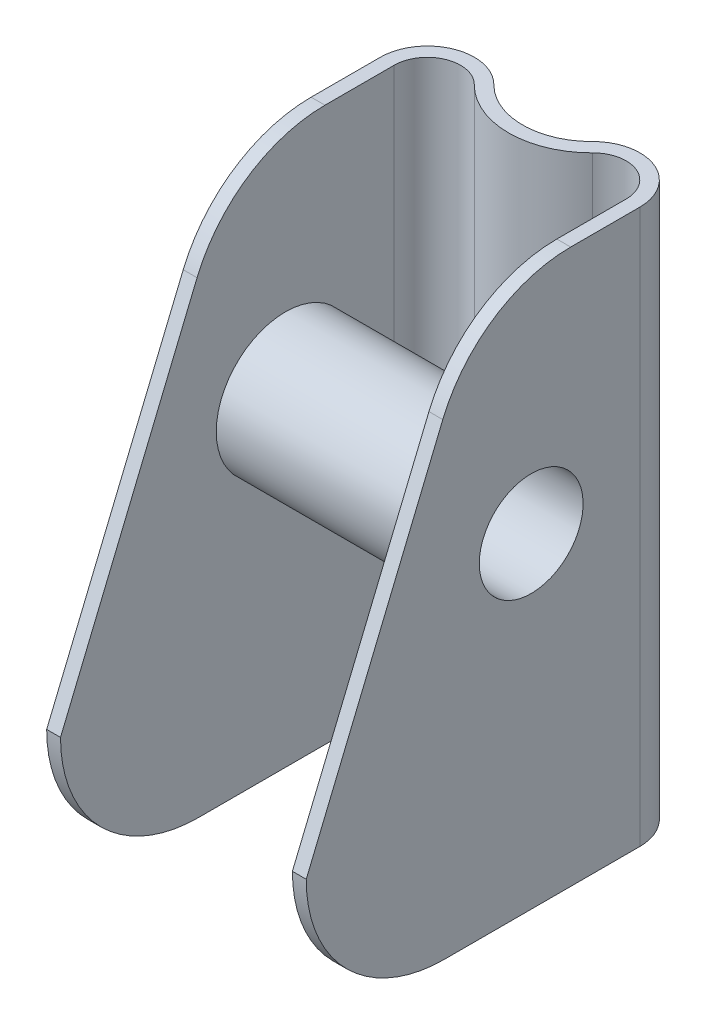
ISO-10303-21;
HEADER;
FILE_DESCRIPTION(('STEP AP214'),'2;1');
FILE_NAME('part.step','',(''),(''),'','','');
FILE_SCHEMA(('AUTOMOTIVE_DESIGN { 1 0 10303 214 1 1 1 1 }'));
ENDSEC;
DATA;
#1=APPLICATION_CONTEXT('core data for automotive mechanical design processes');
#2=APPLICATION_PROTOCOL_DEFINITION('international standard','automotive_design',2000,#1);
#3=PRODUCT_CONTEXT('',#1,'mechanical');
#4=PRODUCT('Part','Part','',(#3));
#5=PRODUCT_RELATED_PRODUCT_CATEGORY('part','',(#4));
#6=PRODUCT_DEFINITION_FORMATION('','',#4);
#7=PRODUCT_DEFINITION_CONTEXT('part definition',#1,'design');
#8=PRODUCT_DEFINITION('design','',#6,#7);
#9=PRODUCT_DEFINITION_SHAPE('','',#8);
#10=(LENGTH_UNIT() NAMED_UNIT(*) SI_UNIT(.MILLI.,.METRE.));
#11=(NAMED_UNIT(*) PLANE_ANGLE_UNIT() SI_UNIT($,.RADIAN.));
#12=(NAMED_UNIT(*) SI_UNIT($,.STERADIAN.) SOLID_ANGLE_UNIT());
#13=UNCERTAINTY_MEASURE_WITH_UNIT(LENGTH_MEASURE(1.E-05),#10,'distance_accuracy_value','');
#14=(GEOMETRIC_REPRESENTATION_CONTEXT(3) GLOBAL_UNCERTAINTY_ASSIGNED_CONTEXT((#13)) GLOBAL_UNIT_ASSIGNED_CONTEXT((#10,
#11,#12)) REPRESENTATION_CONTEXT('',''));
#15=CARTESIAN_POINT('',(0.,0.,0.));
#16=DIRECTION('',(0.,0.,1.));
#17=DIRECTION('',(1.,0.,0.));
#18=AXIS2_PLACEMENT_3D('',#15,#16,#17);
#19=CARTESIAN_POINT('',(45.085,-101.6,-61.2213976964227));
#20=DIRECTION('',(-1.,0.,0.));
#21=DIRECTION('',(0.,0.,1.));
#22=AXIS2_PLACEMENT_3D('',#19,#20,#21);
#23=PLANE('',#22);
#24=CARTESIAN_POINT('',(45.085,-41.91,-41.275));
#25=DIRECTION('',(-1.,0.,0.));
#26=DIRECTION('',(0.,0.,1.));
#27=AXIS2_PLACEMENT_3D('',#24,#25,#26);
#28=CIRCLE('',#27,12.7);
#29=CARTESIAN_POINT('',(45.085,-41.91,-28.575));
#30=VERTEX_POINT('',#29);
#31=EDGE_CURVE('E224',#30,#30,#28,.T.);
#32=ORIENTED_EDGE('',*,*,#31,.F.);
#33=EDGE_LOOP('',(#32));
#34=FACE_BOUND('',#33,.T.);
#35=DIRECTION('',(0.,0.923951918105183,-0.382508631314058));
#36=VECTOR('',#35,1.);
#37=CARTESIAN_POINT('',(45.085,-76.2468126521066,0.0193800598652372));
#38=LINE('',#37,#36);
#39=CARTESIAN_POINT('',(45.085,-76.2000000000001,0.));
#40=VERTEX_POINT('',#39);
#41=CARTESIAN_POINT('',(45.085,-15.6842807646229,-25.0530189765511));
#42=VERTEX_POINT('',#41);
#43=EDGE_CURVE('E199',#40,#42,#38,.T.);
#44=ORIENTED_EDGE('',*,*,#43,.T.);
#45=CARTESIAN_POINT('',(45.085,-25.4,-48.5213976964227));
#46=DIRECTION('',(-1.,0.,0.));
#47=DIRECTION('',(0.,0.,1.));
#48=AXIS2_PLACEMENT_3D('',#45,#46,#47);
#49=CIRCLE('',#48,25.4);
#50=CARTESIAN_POINT('',(45.085,0.,-48.5213976964227));
#51=VERTEX_POINT('',#50);
#52=EDGE_CURVE('E206',#42,#51,#49,.T.);
#53=ORIENTED_EDGE('',*,*,#52,.T.);
#54=DIRECTION('',(0.,0.,1.));
#55=VECTOR('',#54,1.);
#56=CARTESIAN_POINT('',(45.085,0.,-61.2213976964227));
#57=LINE('',#56,#55);
#58=CARTESIAN_POINT('',(45.085,0.,-61.2213976964227));
#59=VERTEX_POINT('',#58);
#60=EDGE_CURVE('E256',#59,#51,#57,.T.);
#61=ORIENTED_EDGE('',*,*,#60,.F.);
#62=DIRECTION('',(0.,1.,0.));
#63=VECTOR('',#62,1.);
#64=CARTESIAN_POINT('',(45.085,-101.6,-61.2213976964227));
#65=LINE('',#64,#63);
#66=CARTESIAN_POINT('',(45.085,-101.6,-61.2213976964227));
#67=VERTEX_POINT('',#66);
#68=EDGE_CURVE('E225',#67,#59,#65,.T.);
#69=ORIENTED_EDGE('',*,*,#68,.F.);
#70=DIRECTION('',(0.,0.,1.));
#71=VECTOR('',#70,1.);
#72=CARTESIAN_POINT('',(45.085,-101.6,-61.2213976964227));
#73=LINE('',#72,#71);
#74=CARTESIAN_POINT('',(45.085,-101.6,-25.4));
#75=VERTEX_POINT('',#74);
#76=EDGE_CURVE('E229',#67,#75,#73,.T.);
#77=ORIENTED_EDGE('',*,*,#76,.T.);
#78=CARTESIAN_POINT('',(45.085,-76.2,-25.4));
#79=DIRECTION('',(-1.,0.,0.));
#80=DIRECTION('',(0.,0.,1.));
#81=AXIS2_PLACEMENT_3D('',#78,#79,#80);
#82=CIRCLE('',#81,25.4);
#83=EDGE_CURVE('E83',#40,#75,#82,.F.);
#84=ORIENTED_EDGE('',*,*,#83,.F.);
#85=EDGE_LOOP('',(#44,#53,#61,#69,#77,#84));
#86=FACE_BOUND('',#85,.T.);
#87=ADVANCED_FACE('F61',(#34,#86),#23,.T.);
#88=CARTESIAN_POINT('',(2.54,-101.6,0.));
#89=DIRECTION('',(1.,0.,0.));
#90=DIRECTION('',(0.,0.,-1.));
#91=AXIS2_PLACEMENT_3D('',#88,#89,#90);
#92=PLANE('',#91);
#93=CARTESIAN_POINT('',(2.54,-41.91,-41.275));
#94=DIRECTION('',(1.,0.,0.));
#95=DIRECTION('',(0.,0.,-1.));
#96=AXIS2_PLACEMENT_3D('',#93,#94,#95);
#97=CIRCLE('',#96,12.7);
#98=CARTESIAN_POINT('',(2.54,-41.91,-53.975));
#99=VERTEX_POINT('',#98);
#100=EDGE_CURVE('E221',#99,#99,#97,.T.);
#101=ORIENTED_EDGE('',*,*,#100,.F.);
#102=EDGE_LOOP('',(#101));
#103=FACE_BOUND('',#102,.T.);
#104=DIRECTION('',(0.,0.,-1.));
#105=VECTOR('',#104,1.);
#106=CARTESIAN_POINT('',(2.54,0.,0.));
#107=LINE('',#106,#105);
#108=CARTESIAN_POINT('',(2.54,0.,-48.5213976964227));
#109=VERTEX_POINT('',#108);
#110=CARTESIAN_POINT('',(2.54,0.,-61.2213976964227));
#111=VERTEX_POINT('',#110);
#112=EDGE_CURVE('E270',#109,#111,#107,.T.);
#113=ORIENTED_EDGE('',*,*,#112,.F.);
#114=CARTESIAN_POINT('',(2.54,-25.4,-48.5213976964227));
#115=DIRECTION('',(1.,0.,0.));
#116=DIRECTION('',(0.,0.,-1.));
#117=AXIS2_PLACEMENT_3D('',#114,#115,#116);
#118=CIRCLE('',#117,25.4);
#119=CARTESIAN_POINT('',(2.54,-15.6842807646229,-25.0530189765511));
#120=VERTEX_POINT('',#119);
#121=EDGE_CURVE('E204',#109,#120,#118,.T.);
#122=ORIENTED_EDGE('',*,*,#121,.T.);
#123=DIRECTION('',(0.,-0.923951918105183,0.382508631314058));
#124=VECTOR('',#123,1.);
#125=CARTESIAN_POINT('',(2.54,-97.8836535330442,8.97685742329807));
#126=LINE('',#125,#124);
#127=CARTESIAN_POINT('',(2.54,-76.2000000000001,0.));
#128=VERTEX_POINT('',#127);
#129=EDGE_CURVE('E179',#120,#128,#126,.T.);
#130=ORIENTED_EDGE('',*,*,#129,.T.);
#131=CARTESIAN_POINT('',(2.54,-76.2,-25.4));
#132=DIRECTION('',(1.,0.,0.));
#133=DIRECTION('',(0.,0.,-1.));
#134=AXIS2_PLACEMENT_3D('',#131,#132,#133);
#135=CIRCLE('',#134,25.4);
#136=CARTESIAN_POINT('',(2.54,-101.6,-25.4));
#137=VERTEX_POINT('',#136);
#138=EDGE_CURVE('E216',#137,#128,#135,.F.);
#139=ORIENTED_EDGE('',*,*,#138,.F.);
#140=DIRECTION('',(0.,0.,-1.));
#141=VECTOR('',#140,1.);
#142=CARTESIAN_POINT('',(2.54,-101.6,0.));
#143=LINE('',#142,#141);
#144=CARTESIAN_POINT('',(2.54,-101.6,-61.2213976964227));
#145=VERTEX_POINT('',#144);
#146=EDGE_CURVE('E244',#137,#145,#143,.T.);
#147=ORIENTED_EDGE('',*,*,#146,.T.);
#148=DIRECTION('',(0.,1.,0.));
#149=VECTOR('',#148,1.);
#150=CARTESIAN_POINT('',(2.54,-101.6,-61.2213976964227));
#151=LINE('',#150,#149);
#152=EDGE_CURVE('E285',#145,#111,#151,.T.);
#153=ORIENTED_EDGE('',*,*,#152,.T.);
#154=EDGE_LOOP('',(#113,#122,#130,#139,#147,#153));
#155=FACE_BOUND('',#154,.T.);
#156=ADVANCED_FACE('F311',(#103,#155),#92,.T.);
#157=CARTESIAN_POINT('',(0.,-101.6,0.));
#158=DIRECTION('',(1.,0.,0.));
#159=DIRECTION('',(0.,0.,-1.));
#160=AXIS2_PLACEMENT_3D('',#157,#158,#159);
#161=PLANE('',#160);
#162=CARTESIAN_POINT('',(0.,-41.91,-41.275));
#163=DIRECTION('',(-1.,0.,0.));
#164=DIRECTION('',(0.,0.,1.));
#165=AXIS2_PLACEMENT_3D('',#162,#163,#164);
#166=CIRCLE('',#165,9.525);
#167=CARTESIAN_POINT('',(0.,-41.91,-31.75));
#168=VERTEX_POINT('',#167);
#169=EDGE_CURVE('E220',#168,#168,#166,.T.);
#170=ORIENTED_EDGE('',*,*,#169,.F.);
#171=EDGE_LOOP('',(#170));
#172=FACE_BOUND('',#171,.T.);
#173=CARTESIAN_POINT('',(0.,-25.4,-48.5213976964227));
#174=DIRECTION('',(-1.,0.,0.));
#175=DIRECTION('',(0.,0.,1.));
#176=AXIS2_PLACEMENT_3D('',#173,#174,#175);
#177=CIRCLE('',#176,25.4);
#178=CARTESIAN_POINT('',(0.,-15.6842807646229,-25.0530189765511));
#179=VERTEX_POINT('',#178);
#180=CARTESIAN_POINT('',(0.,0.,-48.5213976964227));
#181=VERTEX_POINT('',#180);
#182=EDGE_CURVE('E183',#179,#181,#177,.T.);
#183=ORIENTED_EDGE('',*,*,#182,.T.);
#184=DIRECTION('',(0.,0.,-1.));
#185=VECTOR('',#184,1.);
#186=CARTESIAN_POINT('',(0.,0.,0.));
#187=LINE('',#186,#185);
#188=CARTESIAN_POINT('',(0.,0.,-61.2213976964227));
#189=VERTEX_POINT('',#188);
#190=EDGE_CURVE('E268',#181,#189,#187,.T.);
#191=ORIENTED_EDGE('',*,*,#190,.T.);
#192=DIRECTION('',(0.,1.,0.));
#193=VECTOR('',#192,1.);
#194=CARTESIAN_POINT('',(0.,-101.6,-61.2213976964227));
#195=LINE('',#194,#193);
#196=CARTESIAN_POINT('',(0.,-101.6,-61.2213976964227));
#197=VERTEX_POINT('',#196);
#198=EDGE_CURVE('E288',#197,#189,#195,.T.);
#199=ORIENTED_EDGE('',*,*,#198,.F.);
#200=DIRECTION('',(0.,0.,-1.));
#201=VECTOR('',#200,1.);
#202=CARTESIAN_POINT('',(0.,-101.6,0.));
#203=LINE('',#202,#201);
#204=CARTESIAN_POINT('',(0.,-101.6,-25.4));
#205=VERTEX_POINT('',#204);
#206=EDGE_CURVE('E242',#205,#197,#203,.T.);
#207=ORIENTED_EDGE('',*,*,#206,.F.);
#208=CARTESIAN_POINT('',(0.,-76.2,-25.4));
#209=DIRECTION('',(1.,0.,0.));
#210=DIRECTION('',(0.,0.,-1.));
#211=AXIS2_PLACEMENT_3D('',#208,#209,#210);
#212=CIRCLE('',#211,25.4);
#213=CARTESIAN_POINT('',(0.,-76.2000000000001,0.));
#214=VERTEX_POINT('',#213);
#215=EDGE_CURVE('E75',#214,#205,#212,.T.);
#216=ORIENTED_EDGE('',*,*,#215,.F.);
#217=DIRECTION('',(0.,0.923951918105183,-0.382508631314058));
#218=VECTOR('',#217,1.);
#219=CARTESIAN_POINT('',(0.,-122.583612597842,19.202440973971));
#220=LINE('',#219,#218);
#221=EDGE_CURVE('E177',#214,#179,#220,.T.);
#222=ORIENTED_EDGE('',*,*,#221,.T.);
#223=EDGE_LOOP('',(#183,#191,#199,#207,#216,#222));
#224=FACE_BOUND('',#223,.T.);
#225=ADVANCED_FACE('F191',(#172,#224),#161,.F.);
#226=CARTESIAN_POINT('',(47.625,-101.6,-61.2213976964227));
#227=DIRECTION('',(-1.,0.,0.));
#228=DIRECTION('',(0.,0.,1.));
#229=AXIS2_PLACEMENT_3D('',#226,#227,#228);
#230=PLANE('',#229);
#231=CARTESIAN_POINT('',(47.625,-41.91,-41.275));
#232=DIRECTION('',(-1.,0.,0.));
#233=DIRECTION('',(0.,0.,1.));
#234=AXIS2_PLACEMENT_3D('',#231,#232,#233);
#235=CIRCLE('',#234,9.525);
#236=CARTESIAN_POINT('',(47.625,-41.91,-31.75));
#237=VERTEX_POINT('',#236);
#238=EDGE_CURVE('E228',#237,#237,#235,.T.);
#239=ORIENTED_EDGE('',*,*,#238,.T.);
#240=EDGE_LOOP('',(#239));
#241=FACE_BOUND('',#240,.T.);
#242=CARTESIAN_POINT('',(47.625,-25.4,-48.5213976964227));
#243=DIRECTION('',(-1.,0.,0.));
#244=DIRECTION('',(0.,0.,1.));
#245=AXIS2_PLACEMENT_3D('',#242,#243,#244);
#246=CIRCLE('',#245,25.4);
#247=CARTESIAN_POINT('',(47.625,-15.6842807646229,-25.0530189765511));
#248=VERTEX_POINT('',#247);
#249=CARTESIAN_POINT('',(47.625,0.,-48.5213976964227));
#250=VERTEX_POINT('',#249);
#251=EDGE_CURVE('E202',#248,#250,#246,.T.);
#252=ORIENTED_EDGE('',*,*,#251,.F.);
#253=DIRECTION('',(0.,0.923951918105183,-0.382508631314058));
#254=VECTOR('',#253,1.);
#255=CARTESIAN_POINT('',(47.625,-76.2468126521066,0.0193800598652372));
#256=LINE('',#255,#254);
#257=CARTESIAN_POINT('',(47.625,-76.2000000000001,0.));
#258=VERTEX_POINT('',#257);
#259=EDGE_CURVE('E193',#258,#248,#256,.T.);
#260=ORIENTED_EDGE('',*,*,#259,.F.);
#261=CARTESIAN_POINT('',(47.625,-76.2,-25.4));
#262=DIRECTION('',(-1.,0.,0.));
#263=DIRECTION('',(0.,0.,1.));
#264=AXIS2_PLACEMENT_3D('',#261,#262,#263);
#265=CIRCLE('',#264,25.4);
#266=CARTESIAN_POINT('',(47.625,-101.6,-25.4));
#267=VERTEX_POINT('',#266);
#268=EDGE_CURVE('E213',#258,#267,#265,.F.);
#269=ORIENTED_EDGE('',*,*,#268,.T.);
#270=DIRECTION('',(0.,0.,1.));
#271=VECTOR('',#270,1.);
#272=CARTESIAN_POINT('',(47.625,-101.6,-61.2213976964227));
#273=LINE('',#272,#271);
#274=CARTESIAN_POINT('',(47.625,-101.6,-61.2213976964227));
#275=VERTEX_POINT('',#274);
#276=EDGE_CURVE('E232',#275,#267,#273,.T.);
#277=ORIENTED_EDGE('',*,*,#276,.F.);
#278=DIRECTION('',(0.,1.,0.));
#279=VECTOR('',#278,1.);
#280=CARTESIAN_POINT('',(47.625,-101.6,-61.2213976964227));
#281=LINE('',#280,#279);
#282=CARTESIAN_POINT('',(47.625,0.,-61.2213976964227));
#283=VERTEX_POINT('',#282);
#284=EDGE_CURVE('E255',#275,#283,#281,.T.);
#285=ORIENTED_EDGE('',*,*,#284,.T.);
#286=DIRECTION('',(0.,0.,1.));
#287=VECTOR('',#286,1.);
#288=CARTESIAN_POINT('',(47.625,0.,-61.2213976964227));
#289=LINE('',#288,#287);
#290=EDGE_CURVE('E259',#283,#250,#289,.T.);
#291=ORIENTED_EDGE('',*,*,#290,.T.);
#292=EDGE_LOOP('',(#252,#260,#269,#277,#285,#291));
#293=FACE_BOUND('',#292,.T.);
#294=ADVANCED_FACE('F344',(#241,#293),#230,.F.);
#295=CARTESIAN_POINT('',(38.9963976964227,0.,-61.2213976964227));
#296=DIRECTION('',(0.,-1.,0.));
#297=DIRECTION('',(0.,0.,-1.));
#298=AXIS2_PLACEMENT_3D('',#295,#296,#297);
#299=PLANE('',#298);
#300=DIRECTION('',(-1.,0.,0.));
#301=VECTOR('',#300,1.);
#302=CARTESIAN_POINT('',(101.6,0.,-48.5213976964227));
#303=LINE('',#302,#301);
#304=EDGE_CURVE('E12',#250,#51,#303,.T.);
#305=ORIENTED_EDGE('',*,*,#304,.F.);
#306=ORIENTED_EDGE('',*,*,#290,.F.);
#307=CARTESIAN_POINT('',(38.9963976964227,0.,-61.2213976964227));
#308=DIRECTION('',(0.,-1.,0.));
#309=DIRECTION('',(0.,0.,-1.));
#310=AXIS2_PLACEMENT_3D('',#307,#308,#309);
#311=CIRCLE('',#310,8.62860230357726);
#312=CARTESIAN_POINT('',(32.8536691305354,0.,-67.281072892267));
#313=VERTEX_POINT('',#312);
#314=EDGE_CURVE('E262',#313,#283,#311,.T.);
#315=ORIENTED_EDGE('',*,*,#314,.F.);
#316=CARTESIAN_POINT('',(23.8125,0.,-76.2));
#317=DIRECTION('',(0.,1.,0.));
#318=DIRECTION('',(0.,0.,1.));
#319=AXIS2_PLACEMENT_3D('',#316,#317,#318);
#320=CIRCLE('',#319,12.7);
#321=CARTESIAN_POINT('',(14.7713308694646,0.,-67.281072892267));
#322=VERTEX_POINT('',#321);
#323=EDGE_CURVE('E264',#322,#313,#320,.T.);
#324=ORIENTED_EDGE('',*,*,#323,.F.);
#325=CARTESIAN_POINT('',(8.62860230357726,0.,-61.2213976964227));
#326=DIRECTION('',(0.,-1.,0.));
#327=DIRECTION('',(0.,0.,-1.));
#328=AXIS2_PLACEMENT_3D('',#325,#326,#327);
#329=CIRCLE('',#328,8.62860230357727);
#330=EDGE_CURVE('E266',#189,#322,#329,.T.);
#331=ORIENTED_EDGE('',*,*,#330,.F.);
#332=ORIENTED_EDGE('',*,*,#190,.F.);
#333=EDGE_CURVE('E64',#109,#181,#303,.T.);
#334=ORIENTED_EDGE('',*,*,#333,.F.);
#335=ORIENTED_EDGE('',*,*,#112,.T.);
#336=CARTESIAN_POINT('',(8.62860230357726,0.,-61.2213976964227));
#337=DIRECTION('',(0.,1.,0.));
#338=DIRECTION('',(1.,0.,0.));
#339=AXIS2_PLACEMENT_3D('',#336,#337,#338);
#340=CIRCLE('',#339,6.08860230357727);
#341=CARTESIAN_POINT('',(12.9630970433575,0.,-65.4972874707204));
#342=VERTEX_POINT('',#341);
#343=EDGE_CURVE('E272',#111,#342,#340,.F.);
#344=ORIENTED_EDGE('',*,*,#343,.T.);
#345=CARTESIAN_POINT('',(23.8125,0.,-76.2));
#346=DIRECTION('',(0.,1.,0.));
#347=DIRECTION('',(1.,0.,0.));
#348=AXIS2_PLACEMENT_3D('',#345,#346,#347);
#349=CIRCLE('',#348,15.24);
#350=CARTESIAN_POINT('',(34.6619029566425,0.,-65.4972874707204));
#351=VERTEX_POINT('',#350);
#352=EDGE_CURVE('E275',#342,#351,#349,.T.);
#353=ORIENTED_EDGE('',*,*,#352,.T.);
#354=CARTESIAN_POINT('',(38.9963976964227,0.,-61.2213976964227));
#355=DIRECTION('',(0.,1.,0.));
#356=DIRECTION('',(1.,0.,0.));
#357=AXIS2_PLACEMENT_3D('',#354,#355,#356);
#358=CIRCLE('',#357,6.08860230357726);
#359=EDGE_CURVE('E233',#351,#59,#358,.F.);
#360=ORIENTED_EDGE('',*,*,#359,.T.);
#361=ORIENTED_EDGE('',*,*,#60,.T.);
#362=EDGE_LOOP('',(#305,#306,#315,#324,#331,#332,#334,#335,#344,#353,#360,#361));
#363=FACE_BOUND('',#362,.T.);
#364=ADVANCED_FACE('F323',(#363),#299,.F.);
#365=CARTESIAN_POINT('',(38.9963976964227,-101.6,-61.2213976964227));
#366=DIRECTION('',(0.,1.,0.));
#367=DIRECTION('',(0.,0.,1.));
#368=AXIS2_PLACEMENT_3D('',#365,#366,#367);
#369=CYLINDRICAL_SURFACE('',#368,6.08860230357726);
#370=ORIENTED_EDGE('',*,*,#359,.F.);
#371=DIRECTION('',(0.,1.,0.));
#372=VECTOR('',#371,1.);
#373=CARTESIAN_POINT('',(34.6619029566425,-101.6,-65.4972874707204));
#374=LINE('',#373,#372);
#375=CARTESIAN_POINT('',(34.6619029566425,-101.6,-65.4972874707204));
#376=VERTEX_POINT('',#375);
#377=EDGE_CURVE('E281',#376,#351,#374,.T.);
#378=ORIENTED_EDGE('',*,*,#377,.F.);
#379=CARTESIAN_POINT('',(38.9963976964227,-101.6,-61.2213976964227));
#380=DIRECTION('',(0.,1.,0.));
#381=DIRECTION('',(1.,0.,0.));
#382=AXIS2_PLACEMENT_3D('',#379,#380,#381);
#383=CIRCLE('',#382,6.08860230357726);
#384=EDGE_CURVE('E252',#376,#67,#383,.F.);
#385=ORIENTED_EDGE('',*,*,#384,.T.);
#386=ORIENTED_EDGE('',*,*,#68,.T.);
#387=EDGE_LOOP('',(#370,#378,#385,#386));
#388=FACE_BOUND('',#387,.T.);
#389=ADVANCED_FACE('F351',(#388),#369,.F.);
#390=CARTESIAN_POINT('',(23.8125,-101.6,-76.2));
#391=DIRECTION('',(0.,1.,0.));
#392=DIRECTION('',(0.,0.,1.));
#393=AXIS2_PLACEMENT_3D('',#390,#391,#392);
#394=CYLINDRICAL_SURFACE('',#393,15.24);
#395=ORIENTED_EDGE('',*,*,#352,.F.);
#396=DIRECTION('',(0.,1.,0.));
#397=VECTOR('',#396,1.);
#398=CARTESIAN_POINT('',(12.9630970433575,-101.6,-65.4972874707204));
#399=LINE('',#398,#397);
#400=CARTESIAN_POINT('',(12.9630970433575,-101.6,-65.4972874707204));
#401=VERTEX_POINT('',#400);
#402=EDGE_CURVE('E283',#401,#342,#399,.T.);
#403=ORIENTED_EDGE('',*,*,#402,.F.);
#404=CARTESIAN_POINT('',(23.8125,-101.6,-76.2));
#405=DIRECTION('',(0.,1.,0.));
#406=DIRECTION('',(1.,0.,0.));
#407=AXIS2_PLACEMENT_3D('',#404,#405,#406);
#408=CIRCLE('',#407,15.24);
#409=EDGE_CURVE('E249',#401,#376,#408,.T.);
#410=ORIENTED_EDGE('',*,*,#409,.T.);
#411=ORIENTED_EDGE('',*,*,#377,.T.);
#412=EDGE_LOOP('',(#395,#403,#410,#411));
#413=FACE_BOUND('',#412,.T.);
#414=ADVANCED_FACE('F353',(#413),#394,.T.);
#415=CARTESIAN_POINT('',(8.62860230357726,-101.6,-61.2213976964227));
#416=DIRECTION('',(0.,1.,0.));
#417=DIRECTION('',(0.,0.,1.));
#418=AXIS2_PLACEMENT_3D('',#415,#416,#417);
#419=CYLINDRICAL_SURFACE('',#418,6.08860230357727);
#420=ORIENTED_EDGE('',*,*,#343,.F.);
#421=ORIENTED_EDGE('',*,*,#152,.F.);
#422=CARTESIAN_POINT('',(8.62860230357726,-101.6,-61.2213976964227));
#423=DIRECTION('',(0.,1.,0.));
#424=DIRECTION('',(1.,0.,0.));
#425=AXIS2_PLACEMENT_3D('',#422,#423,#424);
#426=CIRCLE('',#425,6.08860230357727);
#427=EDGE_CURVE('E246',#145,#401,#426,.F.);
#428=ORIENTED_EDGE('',*,*,#427,.T.);
#429=ORIENTED_EDGE('',*,*,#402,.T.);
#430=EDGE_LOOP('',(#420,#421,#428,#429));
#431=FACE_BOUND('',#430,.T.);
#432=ADVANCED_FACE('F319',(#431),#419,.F.);
#433=CARTESIAN_POINT('',(8.62860230357726,-101.6,-61.2213976964227));
#434=DIRECTION('',(0.,1.,0.));
#435=DIRECTION('',(0.,0.,1.));
#436=AXIS2_PLACEMENT_3D('',#433,#434,#435);
#437=CYLINDRICAL_SURFACE('',#436,8.62860230357727);
#438=ORIENTED_EDGE('',*,*,#330,.T.);
#439=DIRECTION('',(0.,1.,0.));
#440=VECTOR('',#439,1.);
#441=CARTESIAN_POINT('',(14.7713308694646,-101.6,-67.281072892267));
#442=LINE('',#441,#440);
#443=CARTESIAN_POINT('',(14.7713308694646,-101.6,-67.281072892267));
#444=VERTEX_POINT('',#443);
#445=EDGE_CURVE('E291',#444,#322,#442,.T.);
#446=ORIENTED_EDGE('',*,*,#445,.F.);
#447=CARTESIAN_POINT('',(8.62860230357726,-101.6,-61.2213976964227));
#448=DIRECTION('',(0.,-1.,0.));
#449=DIRECTION('',(0.,0.,-1.));
#450=AXIS2_PLACEMENT_3D('',#447,#448,#449);
#451=CIRCLE('',#450,8.62860230357727);
#452=EDGE_CURVE('E240',#197,#444,#451,.T.);
#453=ORIENTED_EDGE('',*,*,#452,.F.);
#454=ORIENTED_EDGE('',*,*,#198,.T.);
#455=EDGE_LOOP('',(#438,#446,#453,#454));
#456=FACE_BOUND('',#455,.T.);
#457=ADVANCED_FACE('F329',(#456),#437,.T.);
#458=CARTESIAN_POINT('',(23.8125,-101.6,-76.2));
#459=DIRECTION('',(0.,1.,0.));
#460=DIRECTION('',(0.,0.,1.));
#461=AXIS2_PLACEMENT_3D('',#458,#459,#460);
#462=CYLINDRICAL_SURFACE('',#461,12.7);
#463=ORIENTED_EDGE('',*,*,#323,.T.);
#464=DIRECTION('',(0.,1.,0.));
#465=VECTOR('',#464,1.);
#466=CARTESIAN_POINT('',(32.8536691305354,-101.6,-67.281072892267));
#467=LINE('',#466,#465);
#468=CARTESIAN_POINT('',(32.8536691305354,-101.6,-67.281072892267));
#469=VERTEX_POINT('',#468);
#470=EDGE_CURVE('E294',#469,#313,#467,.T.);
#471=ORIENTED_EDGE('',*,*,#470,.F.);
#472=CARTESIAN_POINT('',(23.8125,-101.6,-76.2));
#473=DIRECTION('',(0.,1.,0.));
#474=DIRECTION('',(0.,0.,1.));
#475=AXIS2_PLACEMENT_3D('',#472,#473,#474);
#476=CIRCLE('',#475,12.7);
#477=EDGE_CURVE('E238',#444,#469,#476,.T.);
#478=ORIENTED_EDGE('',*,*,#477,.F.);
#479=ORIENTED_EDGE('',*,*,#445,.T.);
#480=EDGE_LOOP('',(#463,#471,#478,#479));
#481=FACE_BOUND('',#480,.T.);
#482=ADVANCED_FACE('F336',(#481),#462,.F.);
#483=CARTESIAN_POINT('',(38.9963976964227,-101.6,-61.2213976964227));
#484=DIRECTION('',(0.,1.,0.));
#485=DIRECTION('',(0.,0.,1.));
#486=AXIS2_PLACEMENT_3D('',#483,#484,#485);
#487=CYLINDRICAL_SURFACE('',#486,8.62860230357726);
#488=ORIENTED_EDGE('',*,*,#314,.T.);
#489=ORIENTED_EDGE('',*,*,#284,.F.);
#490=CARTESIAN_POINT('',(38.9963976964227,-101.6,-61.2213976964227));
#491=DIRECTION('',(0.,-1.,0.));
#492=DIRECTION('',(0.,0.,-1.));
#493=AXIS2_PLACEMENT_3D('',#490,#491,#492);
#494=CIRCLE('',#493,8.62860230357726);
#495=EDGE_CURVE('E236',#469,#275,#494,.T.);
#496=ORIENTED_EDGE('',*,*,#495,.F.);
#497=ORIENTED_EDGE('',*,*,#470,.T.);
#498=EDGE_LOOP('',(#488,#489,#496,#497));
#499=FACE_BOUND('',#498,.T.);
#500=ADVANCED_FACE('F339',(#499),#487,.T.);
#501=CARTESIAN_POINT('',(38.9963976964227,-101.6,-61.2213976964227));
#502=DIRECTION('',(0.,-1.,0.));
#503=DIRECTION('',(0.,0.,-1.));
#504=AXIS2_PLACEMENT_3D('',#501,#502,#503);
#505=PLANE('',#504);
#506=DIRECTION('',(-1.,0.,0.));
#507=VECTOR('',#506,1.);
#508=CARTESIAN_POINT('',(101.6,-101.6,-25.4));
#509=LINE('',#508,#507);
#510=EDGE_CURVE('E303',#205,#137,#509,.F.);
#511=ORIENTED_EDGE('',*,*,#510,.F.);
#512=ORIENTED_EDGE('',*,*,#206,.T.);
#513=ORIENTED_EDGE('',*,*,#452,.T.);
#514=ORIENTED_EDGE('',*,*,#477,.T.);
#515=ORIENTED_EDGE('',*,*,#495,.T.);
#516=ORIENTED_EDGE('',*,*,#276,.T.);
#517=EDGE_CURVE('E302',#75,#267,#509,.F.);
#518=ORIENTED_EDGE('',*,*,#517,.F.);
#519=ORIENTED_EDGE('',*,*,#76,.F.);
#520=ORIENTED_EDGE('',*,*,#384,.F.);
#521=ORIENTED_EDGE('',*,*,#409,.F.);
#522=ORIENTED_EDGE('',*,*,#427,.F.);
#523=ORIENTED_EDGE('',*,*,#146,.F.);
#524=EDGE_LOOP('',(#511,#512,#513,#514,#515,#516,#518,#519,#520,#521,#522,#523));
#525=FACE_BOUND('',#524,.T.);
#526=ADVANCED_FACE('F314',(#525),#505,.T.);
#527=CARTESIAN_POINT('',(101.6,-41.91,-41.275));
#528=DIRECTION('',(-1.,0.,0.));
#529=DIRECTION('',(0.,0.,1.));
#530=AXIS2_PLACEMENT_3D('',#527,#528,#529);
#531=CYLINDRICAL_SURFACE('',#530,9.525);
#532=ORIENTED_EDGE('',*,*,#238,.F.);
#533=EDGE_LOOP('',(#532));
#534=FACE_BOUND('',#533,.T.);
#535=ORIENTED_EDGE('',*,*,#169,.T.);
#536=EDGE_LOOP('',(#535));
#537=FACE_BOUND('',#536,.T.);
#538=ADVANCED_FACE('F367',(#534,#537),#531,.F.);
#539=CARTESIAN_POINT('',(81.0060244842766,-41.91,-41.275));
#540=DIRECTION('',(-1.,0.,0.));
#541=DIRECTION('',(0.,0.,1.));
#542=AXIS2_PLACEMENT_3D('',#539,#540,#541);
#543=CYLINDRICAL_SURFACE('',#542,12.7);
#544=ORIENTED_EDGE('',*,*,#100,.T.);
#545=EDGE_LOOP('',(#544));
#546=FACE_BOUND('',#545,.T.);
#547=ORIENTED_EDGE('',*,*,#31,.T.);
#548=EDGE_LOOP('',(#547));
#549=FACE_BOUND('',#548,.T.);
#550=ADVANCED_FACE('F361',(#546,#549),#543,.T.);
#551=CARTESIAN_POINT('',(101.6,-76.2,-25.4));
#552=DIRECTION('',(-1.,0.,0.));
#553=DIRECTION('',(0.,0.,1.));
#554=AXIS2_PLACEMENT_3D('',#551,#552,#553);
#555=CYLINDRICAL_SURFACE('',#554,25.4);
#556=ORIENTED_EDGE('',*,*,#83,.T.);
#557=ORIENTED_EDGE('',*,*,#517,.T.);
#558=ORIENTED_EDGE('',*,*,#268,.F.);
#559=DIRECTION('',(-1.,0.,0.));
#560=VECTOR('',#559,1.);
#561=CARTESIAN_POINT('',(101.6,-76.2000000000001,0.));
#562=LINE('',#561,#560);
#563=EDGE_CURVE('E211',#258,#40,#562,.T.);
#564=ORIENTED_EDGE('',*,*,#563,.T.);
#565=EDGE_LOOP('',(#556,#557,#558,#564));
#566=FACE_BOUND('',#565,.T.);
#567=ADVANCED_FACE('F359',(#566),#555,.T.);
#568=ORIENTED_EDGE('',*,*,#138,.T.);
#569=EDGE_CURVE('E209',#128,#214,#562,.T.);
#570=ORIENTED_EDGE('',*,*,#569,.T.);
#571=ORIENTED_EDGE('',*,*,#215,.T.);
#572=ORIENTED_EDGE('',*,*,#510,.T.);
#573=EDGE_LOOP('',(#568,#570,#571,#572));
#574=FACE_BOUND('',#573,.T.);
#575=ADVANCED_FACE('F306',(#574),#555,.T.);
#576=CARTESIAN_POINT('',(101.6,-122.583612597842,19.202440973971));
#577=DIRECTION('',(0.,0.382508631314058,0.923951918105182));
#578=DIRECTION('',(0.,-0.923951918105183,0.382508631314058));
#579=AXIS2_PLACEMENT_3D('',#576,#577,#578);
#580=PLANE('',#579);
#581=DIRECTION('',(-1.,0.,0.));
#582=VECTOR('',#581,1.);
#583=CARTESIAN_POINT('',(101.6,-15.6842807646229,-25.0530189765511));
#584=LINE('',#583,#582);
#585=EDGE_CURVE('E173',#120,#179,#584,.T.);
#586=ORIENTED_EDGE('',*,*,#585,.T.);
#587=ORIENTED_EDGE('',*,*,#221,.F.);
#588=ORIENTED_EDGE('',*,*,#569,.F.);
#589=ORIENTED_EDGE('',*,*,#129,.F.);
#590=EDGE_LOOP('',(#586,#587,#588,#589));
#591=FACE_BOUND('',#590,.T.);
#592=ADVANCED_FACE('F175',(#591),#580,.T.);
#593=CARTESIAN_POINT('',(101.6,-25.4,-48.5213976964227));
#594=DIRECTION('',(-1.,0.,0.));
#595=DIRECTION('',(0.,0.,1.));
#596=AXIS2_PLACEMENT_3D('',#593,#594,#595);
#597=CYLINDRICAL_SURFACE('',#596,25.4);
#598=ORIENTED_EDGE('',*,*,#333,.T.);
#599=ORIENTED_EDGE('',*,*,#182,.F.);
#600=ORIENTED_EDGE('',*,*,#585,.F.);
#601=ORIENTED_EDGE('',*,*,#121,.F.);
#602=EDGE_LOOP('',(#598,#599,#600,#601));
#603=FACE_BOUND('',#602,.T.);
#604=ADVANCED_FACE('F186',(#603),#597,.T.);
#605=EDGE_CURVE('E182',#248,#42,#584,.T.);
#606=ORIENTED_EDGE('',*,*,#605,.F.);
#607=ORIENTED_EDGE('',*,*,#251,.T.);
#608=ORIENTED_EDGE('',*,*,#304,.T.);
#609=ORIENTED_EDGE('',*,*,#52,.F.);
#610=EDGE_LOOP('',(#606,#607,#608,#609));
#611=FACE_BOUND('',#610,.T.);
#612=ADVANCED_FACE('F356',(#611),#597,.T.);
#613=ORIENTED_EDGE('',*,*,#563,.F.);
#614=ORIENTED_EDGE('',*,*,#259,.T.);
#615=ORIENTED_EDGE('',*,*,#605,.T.);
#616=ORIENTED_EDGE('',*,*,#43,.F.);
#617=EDGE_LOOP('',(#613,#614,#615,#616));
#618=FACE_BOUND('',#617,.T.);
#619=ADVANCED_FACE('F358',(#618),#580,.T.);
#620=CLOSED_SHELL('',(#87,#156,#225,#294,#364,#389,#414,#432,#457,#482,#500,#526,#538,#550,#567,
#575,#592,#604,#612,#619));
#621=MANIFOLD_SOLID_BREP('B2',#620);
#622=ADVANCED_BREP_SHAPE_REPRESENTATION('',(#18,#621),#14);
#623=SHAPE_DEFINITION_REPRESENTATION(#9,#622);
ENDSEC;
END-ISO-10303-21;
